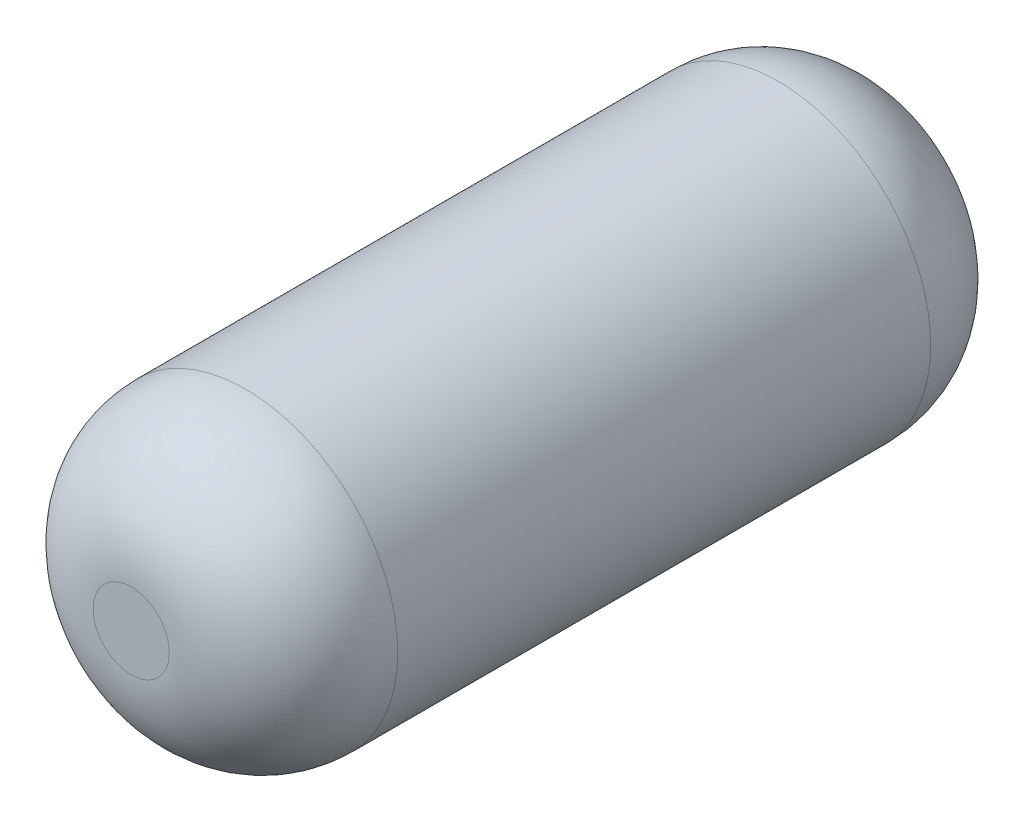
ISO-10303-21;
HEADER;
FILE_DESCRIPTION(('STEP AP214'),'2;1');
FILE_NAME('part.step','',(''),(''),'','','');
FILE_SCHEMA(('AUTOMOTIVE_DESIGN { 1 0 10303 214 1 1 1 1 }'));
ENDSEC;
DATA;
#1=APPLICATION_CONTEXT('core data for automotive mechanical design processes');
#2=APPLICATION_PROTOCOL_DEFINITION('international standard','automotive_design',2000,#1);
#3=PRODUCT_CONTEXT('',#1,'mechanical');
#4=PRODUCT('Part','Part','',(#3));
#5=PRODUCT_RELATED_PRODUCT_CATEGORY('part','',(#4));
#6=PRODUCT_DEFINITION_FORMATION('','',#4);
#7=PRODUCT_DEFINITION_CONTEXT('part definition',#1,'design');
#8=PRODUCT_DEFINITION('design','',#6,#7);
#9=PRODUCT_DEFINITION_SHAPE('','',#8);
#10=(LENGTH_UNIT() NAMED_UNIT(*) SI_UNIT(.MILLI.,.METRE.));
#11=(NAMED_UNIT(*) PLANE_ANGLE_UNIT() SI_UNIT($,.RADIAN.));
#12=(NAMED_UNIT(*) SI_UNIT($,.STERADIAN.) SOLID_ANGLE_UNIT());
#13=UNCERTAINTY_MEASURE_WITH_UNIT(LENGTH_MEASURE(1.E-05),#10,'distance_accuracy_value','');
#14=(GEOMETRIC_REPRESENTATION_CONTEXT(3) GLOBAL_UNCERTAINTY_ASSIGNED_CONTEXT((#13)) GLOBAL_UNIT_ASSIGNED_CONTEXT((#10,
#11,#12)) REPRESENTATION_CONTEXT('',''));
#15=CARTESIAN_POINT('',(0.,0.,0.));
#16=DIRECTION('',(0.,0.,1.));
#17=DIRECTION('',(1.,0.,0.));
#18=AXIS2_PLACEMENT_3D('',#15,#16,#17);
#19=CARTESIAN_POINT('',(0.,0.,20.));
#20=DIRECTION('',(0.,0.,-1.));
#21=DIRECTION('',(-1.,0.,0.));
#22=AXIS2_PLACEMENT_3D('',#19,#20,#21);
#23=CYLINDRICAL_SURFACE('',#22,4.);
#24=CARTESIAN_POINT('',(0.,0.,3.));
#25=DIRECTION('',(0.,0.,1.));
#26=DIRECTION('',(1.,0.,0.));
#27=AXIS2_PLACEMENT_3D('',#24,#25,#26);
#28=CIRCLE('',#27,4.);
#29=CARTESIAN_POINT('',(4.,0.,3.));
#30=VERTEX_POINT('',#29);
#31=EDGE_CURVE('E41',#30,#30,#28,.T.);
#32=ORIENTED_EDGE('',*,*,#31,.T.);
#33=EDGE_LOOP('',(#32));
#34=FACE_BOUND('',#33,.T.);
#35=CARTESIAN_POINT('',(0.,0.,17.));
#36=DIRECTION('',(0.,0.,1.));
#37=DIRECTION('',(1.,0.,0.));
#38=AXIS2_PLACEMENT_3D('',#35,#36,#37);
#39=CIRCLE('',#38,4.);
#40=CARTESIAN_POINT('',(4.,0.,17.));
#41=VERTEX_POINT('',#40);
#42=EDGE_CURVE('E45',#41,#41,#39,.F.);
#43=ORIENTED_EDGE('',*,*,#42,.T.);
#44=EDGE_LOOP('',(#43));
#45=FACE_BOUND('',#44,.T.);
#46=ADVANCED_FACE('F30',(#34,#45),#23,.T.);
#47=CARTESIAN_POINT('',(0.,0.,20.));
#48=DIRECTION('',(0.,0.,1.));
#49=DIRECTION('',(1.,0.,0.));
#50=AXIS2_PLACEMENT_3D('',#47,#48,#49);
#51=PLANE('',#50);
#52=CARTESIAN_POINT('',(0.,0.,20.));
#53=DIRECTION('',(0.,0.,1.));
#54=DIRECTION('',(1.,0.,0.));
#55=AXIS2_PLACEMENT_3D('',#52,#53,#54);
#56=CIRCLE('',#55,1.);
#57=CARTESIAN_POINT('',(1.,0.,20.));
#58=VERTEX_POINT('',#57);
#59=EDGE_CURVE('E10',#58,#58,#56,.T.);
#60=ORIENTED_EDGE('',*,*,#59,.T.);
#61=EDGE_LOOP('',(#60));
#62=FACE_BOUND('',#61,.T.);
#63=ADVANCED_FACE('F61',(#62),#51,.T.);
#64=CARTESIAN_POINT('',(0.,0.,0.));
#65=DIRECTION('',(0.,0.,1.));
#66=DIRECTION('',(1.,0.,0.));
#67=AXIS2_PLACEMENT_3D('',#64,#65,#66);
#68=PLANE('',#67);
#69=CARTESIAN_POINT('',(0.,0.,0.));
#70=DIRECTION('',(0.,0.,1.));
#71=DIRECTION('',(1.,0.,0.));
#72=AXIS2_PLACEMENT_3D('',#69,#70,#71);
#73=CIRCLE('',#72,1.);
#74=CARTESIAN_POINT('',(1.,0.,0.));
#75=VERTEX_POINT('',#74);
#76=EDGE_CURVE('E37',#75,#75,#73,.F.);
#77=ORIENTED_EDGE('',*,*,#76,.T.);
#78=EDGE_LOOP('',(#77));
#79=FACE_BOUND('',#78,.T.);
#80=ADVANCED_FACE('F58',(#79),#68,.F.);
#81=CARTESIAN_POINT('',(0.,0.,3.));
#82=DIRECTION('',(0.,0.,1.));
#83=DIRECTION('',(1.,0.,0.));
#84=AXIS2_PLACEMENT_3D('',#81,#82,#83);
#85=DEGENERATE_TOROIDAL_SURFACE('',#84,1.,3.,.T.);
#86=ORIENTED_EDGE('',*,*,#76,.F.);
#87=EDGE_LOOP('',(#86));
#88=FACE_BOUND('',#87,.T.);
#89=ORIENTED_EDGE('',*,*,#31,.F.);
#90=EDGE_LOOP('',(#89));
#91=FACE_BOUND('',#90,.T.);
#92=ADVANCED_FACE('F54',(#88,#91),#85,.T.);
#93=CARTESIAN_POINT('',(0.,0.,17.));
#94=DIRECTION('',(0.,0.,1.));
#95=DIRECTION('',(1.,0.,0.));
#96=AXIS2_PLACEMENT_3D('',#93,#94,#95);
#97=DEGENERATE_TOROIDAL_SURFACE('',#96,1.,3.,.T.);
#98=ORIENTED_EDGE('',*,*,#42,.F.);
#99=EDGE_LOOP('',(#98));
#100=FACE_BOUND('',#99,.T.);
#101=ORIENTED_EDGE('',*,*,#59,.F.);
#102=EDGE_LOOP('',(#101));
#103=FACE_BOUND('',#102,.T.);
#104=ADVANCED_FACE('F32',(#100,#103),#97,.T.);
#105=CLOSED_SHELL('',(#46,#63,#80,#92,#104));
#106=MANIFOLD_SOLID_BREP('B2',#105);
#107=ADVANCED_BREP_SHAPE_REPRESENTATION('',(#18,#106),#14);
#108=SHAPE_DEFINITION_REPRESENTATION(#9,#107);
ENDSEC;
END-ISO-10303-21;
